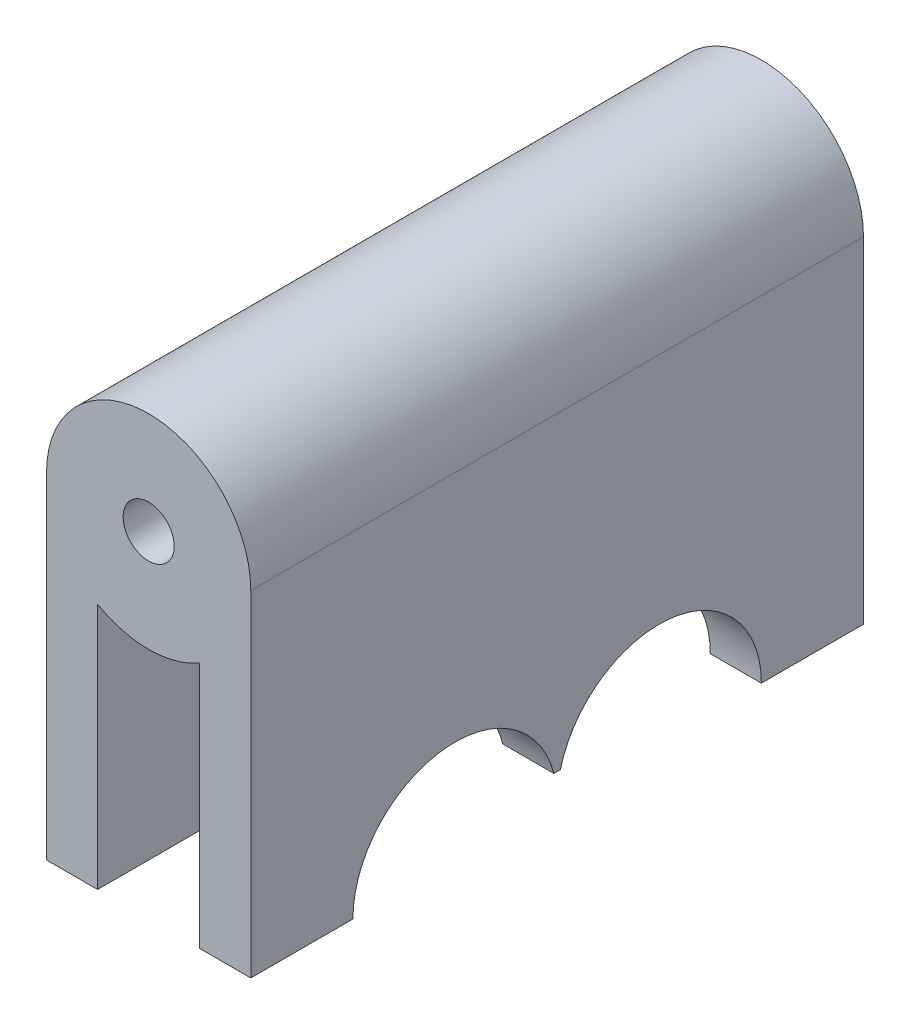
ISO-10303-21;
HEADER;
FILE_DESCRIPTION(('STEP AP214'),'2;1');
FILE_NAME('part.step','',(''),(''),'','','');
FILE_SCHEMA(('AUTOMOTIVE_DESIGN { 1 0 10303 214 1 1 1 1 }'));
ENDSEC;
DATA;
#1=APPLICATION_CONTEXT('core data for automotive mechanical design processes');
#2=APPLICATION_PROTOCOL_DEFINITION('international standard','automotive_design',2000,#1);
#3=PRODUCT_CONTEXT('',#1,'mechanical');
#4=PRODUCT('Part','Part','',(#3));
#5=PRODUCT_RELATED_PRODUCT_CATEGORY('part','',(#4));
#6=PRODUCT_DEFINITION_FORMATION('','',#4);
#7=PRODUCT_DEFINITION_CONTEXT('part definition',#1,'design');
#8=PRODUCT_DEFINITION('design','',#6,#7);
#9=PRODUCT_DEFINITION_SHAPE('','',#8);
#10=(LENGTH_UNIT() NAMED_UNIT(*) SI_UNIT(.MILLI.,.METRE.));
#11=(NAMED_UNIT(*) PLANE_ANGLE_UNIT() SI_UNIT($,.RADIAN.));
#12=(NAMED_UNIT(*) SI_UNIT($,.STERADIAN.) SOLID_ANGLE_UNIT());
#13=UNCERTAINTY_MEASURE_WITH_UNIT(LENGTH_MEASURE(1.E-05),#10,'distance_accuracy_value','');
#14=(GEOMETRIC_REPRESENTATION_CONTEXT(3) GLOBAL_UNCERTAINTY_ASSIGNED_CONTEXT((#13)) GLOBAL_UNIT_ASSIGNED_CONTEXT((#10,
#11,#12)) REPRESENTATION_CONTEXT('',''));
#15=CARTESIAN_POINT('',(0.,0.,0.));
#16=DIRECTION('',(0.,0.,1.));
#17=DIRECTION('',(1.,0.,0.));
#18=AXIS2_PLACEMENT_3D('',#15,#16,#17);
#19=CARTESIAN_POINT('',(-12.7,-38.55212,-44.0467221242086));
#20=DIRECTION('',(0.,-1.,0.));
#21=DIRECTION('',(0.,0.,-1.));
#22=AXIS2_PLACEMENT_3D('',#19,#20,#21);
#23=PLANE('',#22);
#24=DIRECTION('',(0.,0.,-1.));
#25=VECTOR('',#24,1.);
#26=CARTESIAN_POINT('',(6.35000000000002,-38.55212,-44.0467221242086));
#27=LINE('',#26,#25);
#28=CARTESIAN_POINT('',(6.35000000000001,-38.55212,-44.0467221242086));
#29=VERTEX_POINT('',#28);
#30=CARTESIAN_POINT('',(6.35000000000001,-38.55212,-44.8532778757914));
#31=VERTEX_POINT('',#30);
#32=EDGE_CURVE('E202',#29,#31,#27,.T.);
#33=ORIENTED_EDGE('',*,*,#32,.T.);
#34=DIRECTION('',(-1.,0.,0.));
#35=VECTOR('',#34,1.);
#36=CARTESIAN_POINT('',(0.158749999999999,-38.55212,-44.8532778757914));
#37=LINE('',#36,#35);
#38=CARTESIAN_POINT('',(12.7,-38.55212,-44.8532778757914));
#39=VERTEX_POINT('',#38);
#40=EDGE_CURVE('E188',#39,#31,#37,.T.);
#41=ORIENTED_EDGE('',*,*,#40,.F.);
#42=DIRECTION('',(0.,0.,-1.));
#43=VECTOR('',#42,1.);
#44=CARTESIAN_POINT('',(12.7,-38.55212,-44.0467221242086));
#45=LINE('',#44,#43);
#46=CARTESIAN_POINT('',(12.7,-38.55212,-44.0467221242086));
#47=VERTEX_POINT('',#46);
#48=EDGE_CURVE('E206',#39,#47,#45,.F.);
#49=ORIENTED_EDGE('',*,*,#48,.T.);
#50=DIRECTION('',(1.,0.,0.));
#51=VECTOR('',#50,1.);
#52=CARTESIAN_POINT('',(0.158749999999999,-38.55212,-44.0467221242086));
#53=LINE('',#52,#51);
#54=EDGE_CURVE('E171',#29,#47,#53,.T.);
#55=ORIENTED_EDGE('',*,*,#54,.F.);
#56=EDGE_LOOP('',(#33,#41,#49,#55));
#57=FACE_BOUND('',#56,.T.);
#58=ADVANCED_FACE('F17',(#57),#23,.T.);
#59=CARTESIAN_POINT('',(-12.7,-38.55212,-44.0467221242086));
#60=DIRECTION('',(0.,-1.,0.));
#61=DIRECTION('',(0.,0.,-1.));
#62=AXIS2_PLACEMENT_3D('',#59,#60,#61);
#63=PLANE('',#62);
#64=DIRECTION('',(0.,0.,-1.));
#65=VECTOR('',#64,1.);
#66=CARTESIAN_POINT('',(-12.7,-38.55212,-44.0467221242086));
#67=LINE('',#66,#65);
#68=CARTESIAN_POINT('',(-12.7,-38.55212,-44.0467221242086));
#69=VERTEX_POINT('',#68);
#70=CARTESIAN_POINT('',(-12.7,-38.55212,-44.8532778757914));
#71=VERTEX_POINT('',#70);
#72=EDGE_CURVE('E199',#69,#71,#67,.T.);
#73=ORIENTED_EDGE('',*,*,#72,.T.);
#74=DIRECTION('',(-1.,0.,0.));
#75=VECTOR('',#74,1.);
#76=CARTESIAN_POINT('',(-9.525,-38.55212,-44.8532778757914));
#77=LINE('',#76,#75);
#78=CARTESIAN_POINT('',(-6.35,-38.55212,-44.8532778757914));
#79=VERTEX_POINT('',#78);
#80=EDGE_CURVE('E146',#79,#71,#77,.T.);
#81=ORIENTED_EDGE('',*,*,#80,.F.);
#82=DIRECTION('',(0.,0.,-1.));
#83=VECTOR('',#82,1.);
#84=CARTESIAN_POINT('',(-6.35,-38.55212,-44.0467221242086));
#85=LINE('',#84,#83);
#86=CARTESIAN_POINT('',(-6.35,-38.55212,-44.0467221242086));
#87=VERTEX_POINT('',#86);
#88=EDGE_CURVE('E200',#79,#87,#85,.F.);
#89=ORIENTED_EDGE('',*,*,#88,.T.);
#90=DIRECTION('',(1.,0.,0.));
#91=VECTOR('',#90,1.);
#92=CARTESIAN_POINT('',(-9.525,-38.55212,-44.0467221242086));
#93=LINE('',#92,#91);
#94=EDGE_CURVE('E168',#69,#87,#93,.T.);
#95=ORIENTED_EDGE('',*,*,#94,.F.);
#96=EDGE_LOOP('',(#73,#81,#89,#95));
#97=FACE_BOUND('',#96,.T.);
#98=ADVANCED_FACE('F348',(#97),#63,.T.);
#99=CARTESIAN_POINT('',(-12.7,-57.60212,-19.05));
#100=DIRECTION('',(0.,0.,-1.));
#101=DIRECTION('',(-1.,0.,0.));
#102=AXIS2_PLACEMENT_3D('',#99,#100,#101);
#103=PLANE('',#102);
#104=DIRECTION('',(0.,1.,0.));
#105=VECTOR('',#104,1.);
#106=CARTESIAN_POINT('',(6.35000000000002,-57.60212,-19.05));
#107=LINE('',#106,#105);
#108=CARTESIAN_POINT('',(6.35000000000001,-41.7322,-19.05));
#109=VERTEX_POINT('',#108);
#110=CARTESIAN_POINT('',(6.35000000000001,-41.72712,-19.05));
#111=VERTEX_POINT('',#110);
#112=EDGE_CURVE('E195',#109,#111,#107,.T.);
#113=ORIENTED_EDGE('',*,*,#112,.T.);
#114=DIRECTION('',(-1.,0.,0.));
#115=VECTOR('',#114,1.);
#116=CARTESIAN_POINT('',(0.158749999999999,-41.72712,-19.05));
#117=LINE('',#116,#115);
#118=CARTESIAN_POINT('',(12.7,-41.72712,-19.05));
#119=VERTEX_POINT('',#118);
#120=EDGE_CURVE('E182',#119,#111,#117,.T.);
#121=ORIENTED_EDGE('',*,*,#120,.F.);
#122=DIRECTION('',(0.,1.,0.));
#123=VECTOR('',#122,1.);
#124=CARTESIAN_POINT('',(12.7,-57.60212,-19.05));
#125=LINE('',#124,#123);
#126=CARTESIAN_POINT('',(12.7,-41.7322,-19.05));
#127=VERTEX_POINT('',#126);
#128=EDGE_CURVE('E197',#119,#127,#125,.F.);
#129=ORIENTED_EDGE('',*,*,#128,.T.);
#130=DIRECTION('',(1.,0.,0.));
#131=VECTOR('',#130,1.);
#132=CARTESIAN_POINT('',(6.35000000000003,-41.7322,-19.05));
#133=LINE('',#132,#131);
#134=EDGE_CURVE('E149',#109,#127,#133,.T.);
#135=ORIENTED_EDGE('',*,*,#134,.F.);
#136=EDGE_LOOP('',(#113,#121,#129,#135));
#137=FACE_BOUND('',#136,.T.);
#138=ADVANCED_FACE('F350',(#137),#103,.T.);
#139=CARTESIAN_POINT('',(-12.7,-41.72712,-69.85));
#140=DIRECTION('',(0.,0.,1.));
#141=DIRECTION('',(1.,0.,0.));
#142=AXIS2_PLACEMENT_3D('',#139,#140,#141);
#143=PLANE('',#142);
#144=DIRECTION('',(0.,1.,0.));
#145=VECTOR('',#144,1.);
#146=CARTESIAN_POINT('',(6.35000000000002,-41.72712,-69.85));
#147=LINE('',#146,#145);
#148=CARTESIAN_POINT('',(6.35,-41.72712,-69.8500000000001));
#149=VERTEX_POINT('',#148);
#150=CARTESIAN_POINT('',(6.35000000000001,-41.7322,-69.85));
#151=VERTEX_POINT('',#150);
#152=EDGE_CURVE('E191',#149,#151,#147,.F.);
#153=ORIENTED_EDGE('',*,*,#152,.T.);
#154=DIRECTION('',(1.,0.,0.));
#155=VECTOR('',#154,1.);
#156=CARTESIAN_POINT('',(6.35000000000003,-41.7322,-69.85));
#157=LINE('',#156,#155);
#158=CARTESIAN_POINT('',(12.7,-41.7322,-69.85));
#159=VERTEX_POINT('',#158);
#160=EDGE_CURVE('E175',#159,#151,#157,.F.);
#161=ORIENTED_EDGE('',*,*,#160,.F.);
#162=DIRECTION('',(0.,1.,0.));
#163=VECTOR('',#162,1.);
#164=CARTESIAN_POINT('',(12.7,-41.7322,-69.85));
#165=LINE('',#164,#163);
#166=CARTESIAN_POINT('',(12.7,-41.72712,-69.8500000000001));
#167=VERTEX_POINT('',#166);
#168=EDGE_CURVE('E254',#167,#159,#165,.F.);
#169=ORIENTED_EDGE('',*,*,#168,.F.);
#170=DIRECTION('',(1.,0.,0.));
#171=VECTOR('',#170,1.);
#172=CARTESIAN_POINT('',(0.158749999999999,-41.72712,-69.8500000000001));
#173=LINE('',#172,#171);
#174=EDGE_CURVE('E185',#149,#167,#173,.T.);
#175=ORIENTED_EDGE('',*,*,#174,.F.);
#176=EDGE_LOOP('',(#153,#161,#169,#175));
#177=FACE_BOUND('',#176,.T.);
#178=ADVANCED_FACE('F355',(#177),#143,.T.);
#179=CARTESIAN_POINT('',(6.35,-41.72712,-57.15));
#180=DIRECTION('',(1.,0.,0.));
#181=DIRECTION('',(0.,0.,-1.));
#182=AXIS2_PLACEMENT_3D('',#179,#180,#181);
#183=CYLINDRICAL_SURFACE('',#182,12.7000000000001);
#184=CARTESIAN_POINT('',(6.35,-41.72712,-57.15));
#185=DIRECTION('',(1.,0.,0.));
#186=DIRECTION('',(0.,0.,-1.));
#187=AXIS2_PLACEMENT_3D('',#184,#185,#186);
#188=CIRCLE('',#187,12.7000000000001);
#189=EDGE_CURVE('E237',#149,#31,#188,.T.);
#190=ORIENTED_EDGE('',*,*,#189,.F.);
#191=ORIENTED_EDGE('',*,*,#174,.T.);
#192=CARTESIAN_POINT('',(12.7,-41.72712,-57.15));
#193=DIRECTION('',(1.,0.,0.));
#194=DIRECTION('',(0.,0.,-1.));
#195=AXIS2_PLACEMENT_3D('',#192,#193,#194);
#196=CIRCLE('',#195,12.7000000000001);
#197=EDGE_CURVE('E179',#39,#167,#196,.F.);
#198=ORIENTED_EDGE('',*,*,#197,.F.);
#199=ORIENTED_EDGE('',*,*,#40,.T.);
#200=EDGE_LOOP('',(#190,#191,#198,#199));
#201=FACE_BOUND('',#200,.T.);
#202=ADVANCED_FACE('F362',(#201),#183,.F.);
#203=CARTESIAN_POINT('',(6.35,-41.72712,-31.75));
#204=DIRECTION('',(1.,0.,0.));
#205=DIRECTION('',(0.,0.,-1.));
#206=AXIS2_PLACEMENT_3D('',#203,#204,#205);
#207=CYLINDRICAL_SURFACE('',#206,12.7);
#208=CARTESIAN_POINT('',(6.35,-41.72712,-31.75));
#209=DIRECTION('',(1.,0.,0.));
#210=DIRECTION('',(0.,0.,-1.));
#211=AXIS2_PLACEMENT_3D('',#208,#209,#210);
#212=CIRCLE('',#211,12.7);
#213=EDGE_CURVE('E234',#29,#111,#212,.T.);
#214=ORIENTED_EDGE('',*,*,#213,.F.);
#215=ORIENTED_EDGE('',*,*,#54,.T.);
#216=CARTESIAN_POINT('',(12.7,-41.72712,-31.75));
#217=DIRECTION('',(1.,0.,0.));
#218=DIRECTION('',(0.,0.,-1.));
#219=AXIS2_PLACEMENT_3D('',#216,#217,#218);
#220=CIRCLE('',#219,12.7);
#221=EDGE_CURVE('E242',#119,#47,#220,.F.);
#222=ORIENTED_EDGE('',*,*,#221,.F.);
#223=ORIENTED_EDGE('',*,*,#120,.T.);
#224=EDGE_LOOP('',(#214,#215,#222,#223));
#225=FACE_BOUND('',#224,.T.);
#226=ADVANCED_FACE('F366',(#225),#207,.F.);
#227=CARTESIAN_POINT('',(-12.7,-41.72712,-31.75));
#228=DIRECTION('',(1.,0.,0.));
#229=DIRECTION('',(0.,0.,-1.));
#230=AXIS2_PLACEMENT_3D('',#227,#228,#229);
#231=CYLINDRICAL_SURFACE('',#230,12.7);
#232=CARTESIAN_POINT('',(-12.7,-41.72712,-31.75));
#233=DIRECTION('',(1.,0.,0.));
#234=DIRECTION('',(0.,0.,-1.));
#235=AXIS2_PLACEMENT_3D('',#232,#233,#234);
#236=CIRCLE('',#235,12.7);
#237=CARTESIAN_POINT('',(-12.7,-41.72712,-19.05));
#238=VERTEX_POINT('',#237);
#239=EDGE_CURVE('E148',#69,#238,#236,.T.);
#240=ORIENTED_EDGE('',*,*,#239,.F.);
#241=ORIENTED_EDGE('',*,*,#94,.T.);
#242=CARTESIAN_POINT('',(-6.35,-41.72712,-31.75));
#243=DIRECTION('',(1.,0.,0.));
#244=DIRECTION('',(0.,0.,-1.));
#245=AXIS2_PLACEMENT_3D('',#242,#243,#244);
#246=CIRCLE('',#245,12.7);
#247=CARTESIAN_POINT('',(-6.35,-41.72712,-19.05));
#248=VERTEX_POINT('',#247);
#249=EDGE_CURVE('E159',#248,#87,#246,.F.);
#250=ORIENTED_EDGE('',*,*,#249,.F.);
#251=DIRECTION('',(1.,0.,0.));
#252=VECTOR('',#251,1.);
#253=CARTESIAN_POINT('',(-12.7,-41.72712,-19.05));
#254=LINE('',#253,#252);
#255=EDGE_CURVE('E172',#238,#248,#254,.T.);
#256=ORIENTED_EDGE('',*,*,#255,.F.);
#257=EDGE_LOOP('',(#240,#241,#250,#256));
#258=FACE_BOUND('',#257,.T.);
#259=ADVANCED_FACE('F345',(#258),#231,.F.);
#260=CARTESIAN_POINT('',(-12.7,-41.72712,-57.15));
#261=DIRECTION('',(1.,0.,0.));
#262=DIRECTION('',(0.,0.,-1.));
#263=AXIS2_PLACEMENT_3D('',#260,#261,#262);
#264=CYLINDRICAL_SURFACE('',#263,12.7000000000001);
#265=CARTESIAN_POINT('',(-12.7,-41.72712,-57.15));
#266=DIRECTION('',(1.,0.,0.));
#267=DIRECTION('',(0.,0.,-1.));
#268=AXIS2_PLACEMENT_3D('',#265,#266,#267);
#269=CIRCLE('',#268,12.7000000000001);
#270=CARTESIAN_POINT('',(-12.7,-41.72712,-69.8500000000001));
#271=VERTEX_POINT('',#270);
#272=EDGE_CURVE('E20',#271,#71,#269,.T.);
#273=ORIENTED_EDGE('',*,*,#272,.F.);
#274=DIRECTION('',(1.,0.,0.));
#275=VECTOR('',#274,1.);
#276=CARTESIAN_POINT('',(-12.7,-41.72712,-69.85));
#277=LINE('',#276,#275);
#278=CARTESIAN_POINT('',(-6.35,-41.72712,-69.8500000000001));
#279=VERTEX_POINT('',#278);
#280=EDGE_CURVE('E144',#279,#271,#277,.F.);
#281=ORIENTED_EDGE('',*,*,#280,.F.);
#282=CARTESIAN_POINT('',(-6.35,-41.72712,-57.15));
#283=DIRECTION('',(1.,0.,0.));
#284=DIRECTION('',(0.,0.,-1.));
#285=AXIS2_PLACEMENT_3D('',#282,#283,#284);
#286=CIRCLE('',#285,12.7000000000001);
#287=EDGE_CURVE('E230',#79,#279,#286,.F.);
#288=ORIENTED_EDGE('',*,*,#287,.F.);
#289=ORIENTED_EDGE('',*,*,#80,.T.);
#290=EDGE_LOOP('',(#273,#281,#288,#289));
#291=FACE_BOUND('',#290,.T.);
#292=ADVANCED_FACE('F141',(#291),#264,.F.);
#293=CARTESIAN_POINT('',(-12.7,-41.72712,0.));
#294=DIRECTION('',(0.,-1.,0.));
#295=DIRECTION('',(0.,0.,-1.));
#296=AXIS2_PLACEMENT_3D('',#293,#294,#295);
#297=PLANE('',#296);
#298=DIRECTION('',(1.,0.,0.));
#299=VECTOR('',#298,1.);
#300=CARTESIAN_POINT('',(0.000459014668822111,-41.72712,-6.35));
#301=LINE('',#300,#299);
#302=CARTESIAN_POINT('',(-12.7,-41.72712,-6.35));
#303=VERTEX_POINT('',#302);
#304=CARTESIAN_POINT('',(-6.35,-41.72712,-6.35));
#305=VERTEX_POINT('',#304);
#306=EDGE_CURVE('E258',#303,#305,#301,.T.);
#307=ORIENTED_EDGE('',*,*,#306,.F.);
#308=DIRECTION('',(0.,0.,1.));
#309=VECTOR('',#308,1.);
#310=CARTESIAN_POINT('',(-12.7,-41.72712,0.));
#311=LINE('',#310,#309);
#312=EDGE_CURVE('E246',#238,#303,#311,.T.);
#313=ORIENTED_EDGE('',*,*,#312,.F.);
#314=ORIENTED_EDGE('',*,*,#255,.T.);
#315=DIRECTION('',(0.,0.,-1.));
#316=VECTOR('',#315,1.);
#317=CARTESIAN_POINT('',(-6.35,-41.72712,0.));
#318=LINE('',#317,#316);
#319=EDGE_CURVE('E162',#305,#248,#318,.T.);
#320=ORIENTED_EDGE('',*,*,#319,.F.);
#321=EDGE_LOOP('',(#307,#313,#314,#320));
#322=FACE_BOUND('',#321,.T.);
#323=ADVANCED_FACE('F343',(#322),#297,.T.);
#324=CARTESIAN_POINT('',(6.35000000000003,-41.7322,0.));
#325=DIRECTION('',(0.,-1.,0.));
#326=DIRECTION('',(0.,0.,-1.));
#327=AXIS2_PLACEMENT_3D('',#324,#325,#326);
#328=PLANE('',#327);
#329=DIRECTION('',(1.,0.,0.));
#330=VECTOR('',#329,1.);
#331=CARTESIAN_POINT('',(0.000459014668822111,-41.7322,-6.35));
#332=LINE('',#331,#330);
#333=CARTESIAN_POINT('',(6.35,-41.7322,-6.35));
#334=VERTEX_POINT('',#333);
#335=CARTESIAN_POINT('',(12.7,-41.7322,-6.35));
#336=VERTEX_POINT('',#335);
#337=EDGE_CURVE('E263',#334,#336,#332,.T.);
#338=ORIENTED_EDGE('',*,*,#337,.F.);
#339=DIRECTION('',(0.,0.,1.));
#340=VECTOR('',#339,1.);
#341=CARTESIAN_POINT('',(6.35,-41.7322,0.));
#342=LINE('',#341,#340);
#343=EDGE_CURVE('E166',#109,#334,#342,.T.);
#344=ORIENTED_EDGE('',*,*,#343,.F.);
#345=ORIENTED_EDGE('',*,*,#134,.T.);
#346=DIRECTION('',(0.,0.,-1.));
#347=VECTOR('',#346,1.);
#348=CARTESIAN_POINT('',(12.7,-41.7322,0.));
#349=LINE('',#348,#347);
#350=EDGE_CURVE('E244',#336,#127,#349,.T.);
#351=ORIENTED_EDGE('',*,*,#350,.F.);
#352=EDGE_LOOP('',(#338,#344,#345,#351));
#353=FACE_BOUND('',#352,.T.);
#354=ADVANCED_FACE('F377',(#353),#328,.T.);
#355=CARTESIAN_POINT('',(-12.7,0.,0.));
#356=DIRECTION('',(-1.,0.,0.));
#357=DIRECTION('',(0.,0.,1.));
#358=AXIS2_PLACEMENT_3D('',#355,#356,#357);
#359=PLANE('',#358);
#360=DIRECTION('',(0.,1.,0.));
#361=VECTOR('',#360,1.);
#362=CARTESIAN_POINT('',(-12.7,-17.8377750256243,-82.55));
#363=LINE('',#362,#361);
#364=CARTESIAN_POINT('',(-12.7,-41.72712,-82.55));
#365=VERTEX_POINT('',#364);
#366=CARTESIAN_POINT('',(-12.7,0.,-82.55));
#367=VERTEX_POINT('',#366);
#368=EDGE_CURVE('E154',#365,#367,#363,.T.);
#369=ORIENTED_EDGE('',*,*,#368,.F.);
#370=DIRECTION('',(0.,0.,-1.));
#371=VECTOR('',#370,1.);
#372=CARTESIAN_POINT('',(-12.7,-41.72712,0.));
#373=LINE('',#372,#371);
#374=EDGE_CURVE('E151',#271,#365,#373,.T.);
#375=ORIENTED_EDGE('',*,*,#374,.F.);
#376=ORIENTED_EDGE('',*,*,#272,.T.);
#377=ORIENTED_EDGE('',*,*,#72,.F.);
#378=ORIENTED_EDGE('',*,*,#239,.T.);
#379=ORIENTED_EDGE('',*,*,#312,.T.);
#380=DIRECTION('',(0.,1.,0.));
#381=VECTOR('',#380,1.);
#382=CARTESIAN_POINT('',(-12.7,-17.8377750256243,-6.35));
#383=LINE('',#382,#381);
#384=CARTESIAN_POINT('',(-12.7,0.,-6.35));
#385=VERTEX_POINT('',#384);
#386=EDGE_CURVE('E223',#385,#303,#383,.F.);
#387=ORIENTED_EDGE('',*,*,#386,.F.);
#388=DIRECTION('',(0.,0.,-1.));
#389=VECTOR('',#388,1.);
#390=CARTESIAN_POINT('',(-12.7,0.,0.));
#391=LINE('',#390,#389);
#392=EDGE_CURVE('E249',#367,#385,#391,.F.);
#393=ORIENTED_EDGE('',*,*,#392,.F.);
#394=EDGE_LOOP('',(#369,#375,#376,#377,#378,#379,#387,#393));
#395=FACE_BOUND('',#394,.T.);
#396=ADVANCED_FACE('F152',(#395),#359,.T.);
#397=CARTESIAN_POINT('',(0.,0.,-6.35));
#398=DIRECTION('',(0.,0.,-1.));
#399=DIRECTION('',(-1.,0.,0.));
#400=AXIS2_PLACEMENT_3D('',#397,#398,#399);
#401=CYLINDRICAL_SURFACE('',#400,12.7);
#402=CARTESIAN_POINT('',(0.,0.,-6.35));
#403=DIRECTION('',(0.,0.,-1.));
#404=DIRECTION('',(-1.,0.,0.));
#405=AXIS2_PLACEMENT_3D('',#402,#403,#404);
#406=CIRCLE('',#405,12.7);
#407=CARTESIAN_POINT('',(12.7,0.,-6.35));
#408=VERTEX_POINT('',#407);
#409=EDGE_CURVE('E220',#408,#385,#406,.F.);
#410=ORIENTED_EDGE('',*,*,#409,.F.);
#411=DIRECTION('',(0.,0.,-1.));
#412=VECTOR('',#411,1.);
#413=CARTESIAN_POINT('',(12.7,0.,0.));
#414=LINE('',#413,#412);
#415=CARTESIAN_POINT('',(12.7,0.,-82.55));
#416=VERTEX_POINT('',#415);
#417=EDGE_CURVE('E262',#416,#408,#414,.F.);
#418=ORIENTED_EDGE('',*,*,#417,.F.);
#419=CARTESIAN_POINT('',(0.,0.,-82.55));
#420=DIRECTION('',(0.,0.,-1.));
#421=DIRECTION('',(-1.,0.,0.));
#422=AXIS2_PLACEMENT_3D('',#419,#420,#421);
#423=CIRCLE('',#422,12.7);
#424=EDGE_CURVE('E216',#367,#416,#423,.T.);
#425=ORIENTED_EDGE('',*,*,#424,.F.);
#426=ORIENTED_EDGE('',*,*,#392,.T.);
#427=EDGE_LOOP('',(#410,#418,#425,#426));
#428=FACE_BOUND('',#427,.T.);
#429=ADVANCED_FACE('F299',(#428),#401,.T.);
#430=CARTESIAN_POINT('',(12.7,-41.7322,0.));
#431=DIRECTION('',(1.,0.,0.));
#432=DIRECTION('',(0.,0.,-1.));
#433=AXIS2_PLACEMENT_3D('',#430,#431,#432);
#434=PLANE('',#433);
#435=ORIENTED_EDGE('',*,*,#48,.F.);
#436=ORIENTED_EDGE('',*,*,#197,.T.);
#437=ORIENTED_EDGE('',*,*,#168,.T.);
#438=DIRECTION('',(0.,0.,-1.));
#439=VECTOR('',#438,1.);
#440=CARTESIAN_POINT('',(12.7,-41.7322,0.));
#441=LINE('',#440,#439);
#442=CARTESIAN_POINT('',(12.7,-41.7322,-82.55));
#443=VERTEX_POINT('',#442);
#444=EDGE_CURVE('E178',#443,#159,#441,.F.);
#445=ORIENTED_EDGE('',*,*,#444,.F.);
#446=DIRECTION('',(0.,1.,0.));
#447=VECTOR('',#446,1.);
#448=CARTESIAN_POINT('',(12.7,-17.8377750256243,-82.55));
#449=LINE('',#448,#447);
#450=EDGE_CURVE('E219',#416,#443,#449,.F.);
#451=ORIENTED_EDGE('',*,*,#450,.F.);
#452=ORIENTED_EDGE('',*,*,#417,.T.);
#453=DIRECTION('',(0.,1.,0.));
#454=VECTOR('',#453,1.);
#455=CARTESIAN_POINT('',(12.7,-17.8377750256243,-6.35));
#456=LINE('',#455,#454);
#457=EDGE_CURVE('E224',#336,#408,#456,.T.);
#458=ORIENTED_EDGE('',*,*,#457,.F.);
#459=ORIENTED_EDGE('',*,*,#350,.T.);
#460=ORIENTED_EDGE('',*,*,#128,.F.);
#461=ORIENTED_EDGE('',*,*,#221,.T.);
#462=EDGE_LOOP('',(#435,#436,#437,#445,#451,#452,#458,#459,#460,#461));
#463=FACE_BOUND('',#462,.T.);
#464=ADVANCED_FACE('F295',(#463),#434,.T.);
#465=CARTESIAN_POINT('',(6.35000000000003,-41.7322,0.));
#466=DIRECTION('',(0.,-1.,0.));
#467=DIRECTION('',(0.,0.,-1.));
#468=AXIS2_PLACEMENT_3D('',#465,#466,#467);
#469=PLANE('',#468);
#470=DIRECTION('',(-1.,0.,0.));
#471=VECTOR('',#470,1.);
#472=CARTESIAN_POINT('',(0.0004590146688227,-41.7322,-82.55));
#473=LINE('',#472,#471);
#474=CARTESIAN_POINT('',(6.35000000000002,-41.7322,-82.55));
#475=VERTEX_POINT('',#474);
#476=EDGE_CURVE('E285',#443,#475,#473,.T.);
#477=ORIENTED_EDGE('',*,*,#476,.F.);
#478=ORIENTED_EDGE('',*,*,#444,.T.);
#479=ORIENTED_EDGE('',*,*,#160,.T.);
#480=DIRECTION('',(0.,0.,1.));
#481=VECTOR('',#480,1.);
#482=CARTESIAN_POINT('',(6.35,-41.7322,0.));
#483=LINE('',#482,#481);
#484=EDGE_CURVE('E282',#475,#151,#483,.T.);
#485=ORIENTED_EDGE('',*,*,#484,.F.);
#486=EDGE_LOOP('',(#477,#478,#479,#485));
#487=FACE_BOUND('',#486,.T.);
#488=ADVANCED_FACE('F334',(#487),#469,.T.);
#489=CARTESIAN_POINT('',(6.35,-10.9934426280624,0.));
#490=DIRECTION('',(-1.,0.,0.));
#491=DIRECTION('',(0.,0.,1.));
#492=AXIS2_PLACEMENT_3D('',#489,#490,#491);
#493=PLANE('',#492);
#494=DIRECTION('',(0.,1.,0.));
#495=VECTOR('',#494,1.);
#496=CARTESIAN_POINT('',(6.35000000000003,-17.8377750256243,-82.55));
#497=LINE('',#496,#495);
#498=CARTESIAN_POINT('',(6.35000000000002,-10.9934426280624,-82.55));
#499=VERTEX_POINT('',#498);
#500=EDGE_CURVE('E215',#475,#499,#497,.T.);
#501=ORIENTED_EDGE('',*,*,#500,.F.);
#502=ORIENTED_EDGE('',*,*,#484,.T.);
#503=ORIENTED_EDGE('',*,*,#152,.F.);
#504=ORIENTED_EDGE('',*,*,#189,.T.);
#505=ORIENTED_EDGE('',*,*,#32,.F.);
#506=ORIENTED_EDGE('',*,*,#213,.T.);
#507=ORIENTED_EDGE('',*,*,#112,.F.);
#508=ORIENTED_EDGE('',*,*,#343,.T.);
#509=DIRECTION('',(0.,1.,0.));
#510=VECTOR('',#509,1.);
#511=CARTESIAN_POINT('',(6.35,-17.8377750256243,-6.35));
#512=LINE('',#511,#510);
#513=CARTESIAN_POINT('',(6.35,-10.9934426280624,-6.35));
#514=VERTEX_POINT('',#513);
#515=EDGE_CURVE('E227',#514,#334,#512,.F.);
#516=ORIENTED_EDGE('',*,*,#515,.F.);
#517=DIRECTION('',(0.,0.,-1.));
#518=VECTOR('',#517,1.);
#519=CARTESIAN_POINT('',(6.35000000000001,-10.9934426280624,0.));
#520=LINE('',#519,#518);
#521=EDGE_CURVE('E233',#499,#514,#520,.F.);
#522=ORIENTED_EDGE('',*,*,#521,.F.);
#523=EDGE_LOOP('',(#501,#502,#503,#504,#505,#506,#507,#508,#516,#522));
#524=FACE_BOUND('',#523,.T.);
#525=ADVANCED_FACE('F336',(#524),#493,.T.);
#526=CARTESIAN_POINT('',(0.,0.,-6.35));
#527=DIRECTION('',(0.,0.,-1.));
#528=DIRECTION('',(-1.,0.,0.));
#529=AXIS2_PLACEMENT_3D('',#526,#527,#528);
#530=CYLINDRICAL_SURFACE('',#529,12.6956008450368);
#531=CARTESIAN_POINT('',(0.,0.,-6.35));
#532=DIRECTION('',(0.,0.,-1.));
#533=DIRECTION('',(-1.,0.,0.));
#534=AXIS2_PLACEMENT_3D('',#531,#532,#533);
#535=CIRCLE('',#534,12.6956008450368);
#536=CARTESIAN_POINT('',(-6.35,-10.9934426280624,-6.35));
#537=VERTEX_POINT('',#536);
#538=EDGE_CURVE('E225',#537,#514,#535,.F.);
#539=ORIENTED_EDGE('',*,*,#538,.F.);
#540=DIRECTION('',(0.,0.,-1.));
#541=VECTOR('',#540,1.);
#542=CARTESIAN_POINT('',(-6.35,-10.9934426280624,0.));
#543=LINE('',#542,#541);
#544=CARTESIAN_POINT('',(-6.35,-10.9934426280624,-82.55));
#545=VERTEX_POINT('',#544);
#546=EDGE_CURVE('E232',#545,#537,#543,.F.);
#547=ORIENTED_EDGE('',*,*,#546,.F.);
#548=CARTESIAN_POINT('',(0.,0.,-82.55));
#549=DIRECTION('',(0.,0.,-1.));
#550=DIRECTION('',(-1.,0.,0.));
#551=AXIS2_PLACEMENT_3D('',#548,#549,#550);
#552=CIRCLE('',#551,12.6956008450368);
#553=EDGE_CURVE('E211',#499,#545,#552,.T.);
#554=ORIENTED_EDGE('',*,*,#553,.F.);
#555=ORIENTED_EDGE('',*,*,#521,.T.);
#556=EDGE_LOOP('',(#539,#547,#554,#555));
#557=FACE_BOUND('',#556,.T.);
#558=ADVANCED_FACE('F339',(#557),#530,.T.);
#559=CARTESIAN_POINT('',(-6.35,-41.72712,0.));
#560=DIRECTION('',(1.,0.,0.));
#561=DIRECTION('',(0.,0.,-1.));
#562=AXIS2_PLACEMENT_3D('',#559,#560,#561);
#563=PLANE('',#562);
#564=ORIENTED_EDGE('',*,*,#249,.T.);
#565=ORIENTED_EDGE('',*,*,#88,.F.);
#566=ORIENTED_EDGE('',*,*,#287,.T.);
#567=DIRECTION('',(0.,0.,-1.));
#568=VECTOR('',#567,1.);
#569=CARTESIAN_POINT('',(-6.35,-41.72712,0.));
#570=LINE('',#569,#568);
#571=CARTESIAN_POINT('',(-6.35,-41.72712,-82.55));
#572=VERTEX_POINT('',#571);
#573=EDGE_CURVE('E35',#572,#279,#570,.F.);
#574=ORIENTED_EDGE('',*,*,#573,.F.);
#575=DIRECTION('',(0.,1.,0.));
#576=VECTOR('',#575,1.);
#577=CARTESIAN_POINT('',(-6.35,-17.8377750256243,-82.55));
#578=LINE('',#577,#576);
#579=EDGE_CURVE('E214',#545,#572,#578,.F.);
#580=ORIENTED_EDGE('',*,*,#579,.F.);
#581=ORIENTED_EDGE('',*,*,#546,.T.);
#582=DIRECTION('',(0.,1.,0.));
#583=VECTOR('',#582,1.);
#584=CARTESIAN_POINT('',(-6.35,-17.8377750256243,-6.35));
#585=LINE('',#584,#583);
#586=EDGE_CURVE('E228',#305,#537,#585,.T.);
#587=ORIENTED_EDGE('',*,*,#586,.F.);
#588=ORIENTED_EDGE('',*,*,#319,.T.);
#589=EDGE_LOOP('',(#564,#565,#566,#574,#580,#581,#587,#588));
#590=FACE_BOUND('',#589,.T.);
#591=ADVANCED_FACE('F313',(#590),#563,.T.);
#592=CARTESIAN_POINT('',(-12.7,-41.72712,0.));
#593=DIRECTION('',(0.,-1.,0.));
#594=DIRECTION('',(0.,0.,-1.));
#595=AXIS2_PLACEMENT_3D('',#592,#593,#594);
#596=PLANE('',#595);
#597=DIRECTION('',(-1.,0.,0.));
#598=VECTOR('',#597,1.);
#599=CARTESIAN_POINT('',(0.0004590146688227,-41.72712,-82.55));
#600=LINE('',#599,#598);
#601=EDGE_CURVE('E210',#572,#365,#600,.T.);
#602=ORIENTED_EDGE('',*,*,#601,.F.);
#603=ORIENTED_EDGE('',*,*,#573,.T.);
#604=ORIENTED_EDGE('',*,*,#280,.T.);
#605=ORIENTED_EDGE('',*,*,#374,.T.);
#606=EDGE_LOOP('',(#602,#603,#604,#605));
#607=FACE_BOUND('',#606,.T.);
#608=ADVANCED_FACE('F158',(#607),#596,.T.);
#609=CARTESIAN_POINT('',(0.000459014668822111,-17.8377750256243,-6.35));
#610=DIRECTION('',(0.,0.,1.));
#611=DIRECTION('',(1.,0.,0.));
#612=AXIS2_PLACEMENT_3D('',#609,#610,#611);
#613=PLANE('',#612);
#614=CARTESIAN_POINT('',(0.,0.,-6.35));
#615=DIRECTION('',(0.,0.,-1.));
#616=DIRECTION('',(-1.,0.,0.));
#617=AXIS2_PLACEMENT_3D('',#614,#615,#616);
#618=CIRCLE('',#617,3.175);
#619=CARTESIAN_POINT('',(-3.175,0.,-6.35));
#620=VERTEX_POINT('',#619);
#621=EDGE_CURVE('E26',#620,#620,#618,.F.);
#622=ORIENTED_EDGE('',*,*,#621,.F.);
#623=EDGE_LOOP('',(#622));
#624=FACE_BOUND('',#623,.T.);
#625=ORIENTED_EDGE('',*,*,#409,.T.);
#626=ORIENTED_EDGE('',*,*,#386,.T.);
#627=ORIENTED_EDGE('',*,*,#306,.T.);
#628=ORIENTED_EDGE('',*,*,#586,.T.);
#629=ORIENTED_EDGE('',*,*,#538,.T.);
#630=ORIENTED_EDGE('',*,*,#515,.T.);
#631=ORIENTED_EDGE('',*,*,#337,.T.);
#632=ORIENTED_EDGE('',*,*,#457,.T.);
#633=EDGE_LOOP('',(#625,#626,#627,#628,#629,#630,#631,#632));
#634=FACE_BOUND('',#633,.T.);
#635=ADVANCED_FACE('F300',(#624,#634),#613,.T.);
#636=CARTESIAN_POINT('',(0.0004590146688227,-17.8377750256243,-82.55));
#637=DIRECTION('',(0.,0.,-1.));
#638=DIRECTION('',(-1.,0.,0.));
#639=AXIS2_PLACEMENT_3D('',#636,#637,#638);
#640=PLANE('',#639);
#641=CARTESIAN_POINT('',(0.,0.,-82.55));
#642=DIRECTION('',(0.,0.,-1.));
#643=DIRECTION('',(-1.,0.,0.));
#644=AXIS2_PLACEMENT_3D('',#641,#642,#643);
#645=CIRCLE('',#644,3.175);
#646=CARTESIAN_POINT('',(-3.175,0.,-82.55));
#647=VERTEX_POINT('',#646);
#648=EDGE_CURVE('E11',#647,#647,#645,.T.);
#649=ORIENTED_EDGE('',*,*,#648,.F.);
#650=EDGE_LOOP('',(#649));
#651=FACE_BOUND('',#650,.T.);
#652=ORIENTED_EDGE('',*,*,#579,.T.);
#653=ORIENTED_EDGE('',*,*,#601,.T.);
#654=ORIENTED_EDGE('',*,*,#368,.T.);
#655=ORIENTED_EDGE('',*,*,#424,.T.);
#656=ORIENTED_EDGE('',*,*,#450,.T.);
#657=ORIENTED_EDGE('',*,*,#476,.T.);
#658=ORIENTED_EDGE('',*,*,#500,.T.);
#659=ORIENTED_EDGE('',*,*,#553,.T.);
#660=EDGE_LOOP('',(#652,#653,#654,#655,#656,#657,#658,#659));
#661=FACE_BOUND('',#660,.T.);
#662=ADVANCED_FACE('F302',(#651,#661),#640,.T.);
#663=CARTESIAN_POINT('',(0.,0.,-6.35));
#664=DIRECTION('',(0.,0.,-1.));
#665=DIRECTION('',(-1.,0.,0.));
#666=AXIS2_PLACEMENT_3D('',#663,#664,#665);
#667=CYLINDRICAL_SURFACE('',#666,3.175);
#668=ORIENTED_EDGE('',*,*,#621,.T.);
#669=EDGE_LOOP('',(#668));
#670=FACE_BOUND('',#669,.T.);
#671=ORIENTED_EDGE('',*,*,#648,.T.);
#672=EDGE_LOOP('',(#671));
#673=FACE_BOUND('',#672,.T.);
#674=ADVANCED_FACE('F310',(#670,#673),#667,.F.);
#675=CLOSED_SHELL('',(#58,#98,#138,#178,#202,#226,#259,#292,#323,#354,#396,#429,#464,#488,#525,
#558,#591,#608,#635,#662,#674));
#676=MANIFOLD_SOLID_BREP('B1',#675);
#677=ADVANCED_BREP_SHAPE_REPRESENTATION('',(#18,#676),#14);
#678=SHAPE_DEFINITION_REPRESENTATION(#9,#677);
ENDSEC;
END-ISO-10303-21;
